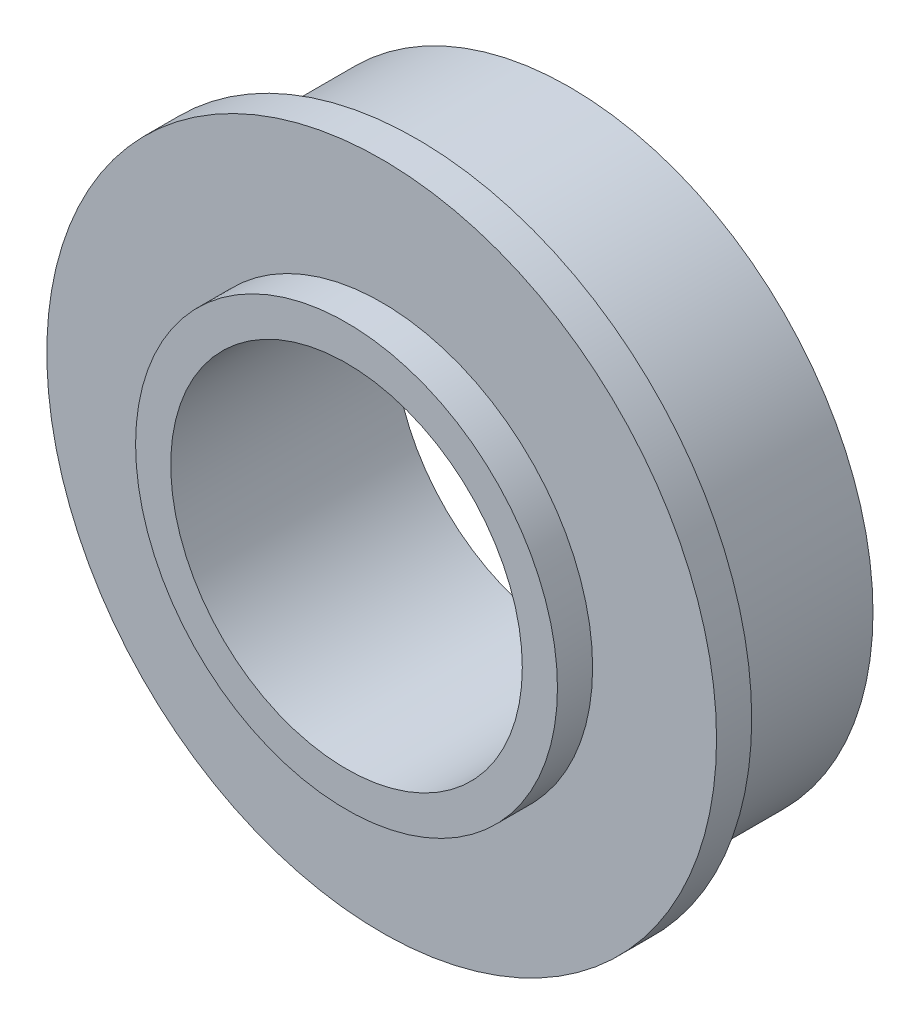
ISO-10303-21;
HEADER;
FILE_DESCRIPTION(('STEP AP214'),'2;1');
FILE_NAME('part.step','',(''),(''),'','','');
FILE_SCHEMA(('AUTOMOTIVE_DESIGN { 1 0 10303 214 1 1 1 1 }'));
ENDSEC;
DATA;
#1=APPLICATION_CONTEXT('core data for automotive mechanical design processes');
#2=APPLICATION_PROTOCOL_DEFINITION('international standard','automotive_design',2000,#1);
#3=PRODUCT_CONTEXT('',#1,'mechanical');
#4=PRODUCT('Part','Part','',(#3));
#5=PRODUCT_RELATED_PRODUCT_CATEGORY('part','',(#4));
#6=PRODUCT_DEFINITION_FORMATION('','',#4);
#7=PRODUCT_DEFINITION_CONTEXT('part definition',#1,'design');
#8=PRODUCT_DEFINITION('design','',#6,#7);
#9=PRODUCT_DEFINITION_SHAPE('','',#8);
#10=(LENGTH_UNIT() NAMED_UNIT(*) SI_UNIT(.MILLI.,.METRE.));
#11=(NAMED_UNIT(*) PLANE_ANGLE_UNIT() SI_UNIT($,.RADIAN.));
#12=(NAMED_UNIT(*) SI_UNIT($,.STERADIAN.) SOLID_ANGLE_UNIT());
#13=UNCERTAINTY_MEASURE_WITH_UNIT(LENGTH_MEASURE(1.E-05),#10,'distance_accuracy_value','');
#14=(GEOMETRIC_REPRESENTATION_CONTEXT(3) GLOBAL_UNCERTAINTY_ASSIGNED_CONTEXT((#13)) GLOBAL_UNIT_ASSIGNED_CONTEXT((#10,
#11,#12)) REPRESENTATION_CONTEXT('',''));
#15=CARTESIAN_POINT('',(0.,0.,0.));
#16=DIRECTION('',(0.,0.,1.));
#17=DIRECTION('',(1.,0.,0.));
#18=AXIS2_PLACEMENT_3D('',#15,#16,#17);
#19=CARTESIAN_POINT('',(0.,0.,10.7));
#20=DIRECTION('',(0.,0.,1.));
#21=DIRECTION('',(1.,0.,0.));
#22=AXIS2_PLACEMENT_3D('',#19,#20,#21);
#23=PLANE('',#22);
#24=CARTESIAN_POINT('',(0.,0.,10.7));
#25=DIRECTION('',(0.,0.,1.));
#26=DIRECTION('',(1.,0.,0.));
#27=AXIS2_PLACEMENT_3D('',#24,#25,#26);
#28=CIRCLE('',#27,19.05);
#29=CARTESIAN_POINT('',(19.05,0.,10.7));
#30=VERTEX_POINT('',#29);
#31=EDGE_CURVE('E52',#30,#30,#28,.T.);
#32=ORIENTED_EDGE('',*,*,#31,.T.);
#33=EDGE_LOOP('',(#32));
#34=FACE_BOUND('',#33,.T.);
#35=CARTESIAN_POINT('',(0.,0.,10.7));
#36=DIRECTION('',(0.,0.,1.));
#37=DIRECTION('',(1.,0.,0.));
#38=AXIS2_PLACEMENT_3D('',#35,#36,#37);
#39=CIRCLE('',#38,12.);
#40=CARTESIAN_POINT('',(12.,0.,10.7));
#41=VERTEX_POINT('',#40);
#42=EDGE_CURVE('E59',#41,#41,#39,.T.);
#43=ORIENTED_EDGE('',*,*,#42,.F.);
#44=EDGE_LOOP('',(#43));
#45=FACE_BOUND('',#44,.T.);
#46=ADVANCED_FACE('F37',(#34,#45),#23,.T.);
#47=CARTESIAN_POINT('',(0.,0.,0.));
#48=DIRECTION('',(0.,0.,1.));
#49=DIRECTION('',(1.,0.,0.));
#50=AXIS2_PLACEMENT_3D('',#47,#48,#49);
#51=PLANE('',#50);
#52=CARTESIAN_POINT('',(0.,0.,0.));
#53=DIRECTION('',(0.,0.,1.));
#54=DIRECTION('',(1.,0.,0.));
#55=AXIS2_PLACEMENT_3D('',#52,#53,#54);
#56=CIRCLE('',#55,17.25);
#57=CARTESIAN_POINT('',(17.25,0.,0.));
#58=VERTEX_POINT('',#57);
#59=EDGE_CURVE('E41',#58,#58,#56,.T.);
#60=ORIENTED_EDGE('',*,*,#59,.F.);
#61=EDGE_LOOP('',(#60));
#62=FACE_BOUND('',#61,.T.);
#63=CARTESIAN_POINT('',(0.,0.,0.));
#64=DIRECTION('',(0.,0.,1.));
#65=DIRECTION('',(1.,0.,0.));
#66=AXIS2_PLACEMENT_3D('',#63,#64,#65);
#67=CIRCLE('',#66,10.);
#68=CARTESIAN_POINT('',(10.,0.,0.));
#69=VERTEX_POINT('',#68);
#70=EDGE_CURVE('E48',#69,#69,#67,.T.);
#71=ORIENTED_EDGE('',*,*,#70,.T.);
#72=EDGE_LOOP('',(#71));
#73=FACE_BOUND('',#72,.T.);
#74=ADVANCED_FACE('F87',(#62,#73),#51,.F.);
#75=CARTESIAN_POINT('',(0.,0.,8.7));
#76=DIRECTION('',(0.,0.,-1.));
#77=DIRECTION('',(-1.,0.,0.));
#78=AXIS2_PLACEMENT_3D('',#75,#76,#77);
#79=CYLINDRICAL_SURFACE('',#78,17.25);
#80=CARTESIAN_POINT('',(0.,0.,8.7));
#81=DIRECTION('',(0.,0.,1.));
#82=DIRECTION('',(1.,0.,0.));
#83=AXIS2_PLACEMENT_3D('',#80,#81,#82);
#84=CIRCLE('',#83,17.25);
#85=CARTESIAN_POINT('',(17.25,0.,8.7));
#86=VERTEX_POINT('',#85);
#87=EDGE_CURVE('E10',#86,#86,#84,.T.);
#88=ORIENTED_EDGE('',*,*,#87,.F.);
#89=EDGE_LOOP('',(#88));
#90=FACE_BOUND('',#89,.T.);
#91=ORIENTED_EDGE('',*,*,#59,.T.);
#92=EDGE_LOOP('',(#91));
#93=FACE_BOUND('',#92,.T.);
#94=ADVANCED_FACE('F39',(#90,#93),#79,.T.);
#95=CARTESIAN_POINT('',(0.,0.,8.7));
#96=DIRECTION('',(0.,0.,-1.));
#97=DIRECTION('',(-1.,0.,0.));
#98=AXIS2_PLACEMENT_3D('',#95,#96,#97);
#99=CYLINDRICAL_SURFACE('',#98,10.);
#100=ORIENTED_EDGE('',*,*,#70,.F.);
#101=EDGE_LOOP('',(#100));
#102=FACE_BOUND('',#101,.T.);
#103=CARTESIAN_POINT('',(0.,0.,12.7));
#104=DIRECTION('',(0.,0.,1.));
#105=DIRECTION('',(1.,0.,0.));
#106=AXIS2_PLACEMENT_3D('',#103,#104,#105);
#107=CIRCLE('',#106,10.);
#108=CARTESIAN_POINT('',(10.,0.,12.7));
#109=VERTEX_POINT('',#108);
#110=EDGE_CURVE('E62',#109,#109,#107,.T.);
#111=ORIENTED_EDGE('',*,*,#110,.T.);
#112=EDGE_LOOP('',(#111));
#113=FACE_BOUND('',#112,.T.);
#114=ADVANCED_FACE('F68',(#102,#113),#99,.F.);
#115=CARTESIAN_POINT('',(0.,0.,8.7));
#116=DIRECTION('',(0.,0.,1.));
#117=DIRECTION('',(1.,0.,0.));
#118=AXIS2_PLACEMENT_3D('',#115,#116,#117);
#119=PLANE('',#118);
#120=ORIENTED_EDGE('',*,*,#87,.T.);
#121=EDGE_LOOP('',(#120));
#122=FACE_BOUND('',#121,.T.);
#123=CARTESIAN_POINT('',(0.,0.,8.7));
#124=DIRECTION('',(0.,0.,1.));
#125=DIRECTION('',(1.,0.,0.));
#126=AXIS2_PLACEMENT_3D('',#123,#124,#125);
#127=CIRCLE('',#126,19.05);
#128=CARTESIAN_POINT('',(19.05,0.,8.7));
#129=VERTEX_POINT('',#128);
#130=EDGE_CURVE('E53',#129,#129,#127,.T.);
#131=ORIENTED_EDGE('',*,*,#130,.F.);
#132=EDGE_LOOP('',(#131));
#133=FACE_BOUND('',#132,.T.);
#134=ADVANCED_FACE('F83',(#122,#133),#119,.F.);
#135=CARTESIAN_POINT('',(0.,0.,10.7));
#136=DIRECTION('',(0.,0.,-1.));
#137=DIRECTION('',(-1.,0.,0.));
#138=AXIS2_PLACEMENT_3D('',#135,#136,#137);
#139=CYLINDRICAL_SURFACE('',#138,19.05);
#140=ORIENTED_EDGE('',*,*,#31,.F.);
#141=EDGE_LOOP('',(#140));
#142=FACE_BOUND('',#141,.T.);
#143=ORIENTED_EDGE('',*,*,#130,.T.);
#144=EDGE_LOOP('',(#143));
#145=FACE_BOUND('',#144,.T.);
#146=ADVANCED_FACE('F73',(#142,#145),#139,.T.);
#147=CARTESIAN_POINT('',(0.,0.,12.7));
#148=DIRECTION('',(0.,0.,1.));
#149=DIRECTION('',(1.,0.,0.));
#150=AXIS2_PLACEMENT_3D('',#147,#148,#149);
#151=PLANE('',#150);
#152=CARTESIAN_POINT('',(0.,0.,12.7));
#153=DIRECTION('',(0.,0.,1.));
#154=DIRECTION('',(1.,0.,0.));
#155=AXIS2_PLACEMENT_3D('',#152,#153,#154);
#156=CIRCLE('',#155,12.);
#157=CARTESIAN_POINT('',(12.,0.,12.7));
#158=VERTEX_POINT('',#157);
#159=EDGE_CURVE('E56',#158,#158,#156,.T.);
#160=ORIENTED_EDGE('',*,*,#159,.T.);
#161=EDGE_LOOP('',(#160));
#162=FACE_BOUND('',#161,.T.);
#163=ORIENTED_EDGE('',*,*,#110,.F.);
#164=EDGE_LOOP('',(#163));
#165=FACE_BOUND('',#164,.T.);
#166=ADVANCED_FACE('F70',(#162,#165),#151,.T.);
#167=CARTESIAN_POINT('',(0.,0.,12.7));
#168=DIRECTION('',(0.,0.,-1.));
#169=DIRECTION('',(-1.,0.,0.));
#170=AXIS2_PLACEMENT_3D('',#167,#168,#169);
#171=CYLINDRICAL_SURFACE('',#170,12.);
#172=ORIENTED_EDGE('',*,*,#159,.F.);
#173=EDGE_LOOP('',(#172));
#174=FACE_BOUND('',#173,.T.);
#175=ORIENTED_EDGE('',*,*,#42,.T.);
#176=EDGE_LOOP('',(#175));
#177=FACE_BOUND('',#176,.T.);
#178=ADVANCED_FACE('F72',(#174,#177),#171,.T.);
#179=CLOSED_SHELL('',(#46,#74,#94,#114,#134,#146,#166,#178));
#180=MANIFOLD_SOLID_BREP('B2',#179);
#181=ADVANCED_BREP_SHAPE_REPRESENTATION('',(#18,#180),#14);
#182=SHAPE_DEFINITION_REPRESENTATION(#9,#181);
ENDSEC;
END-ISO-10303-21;
